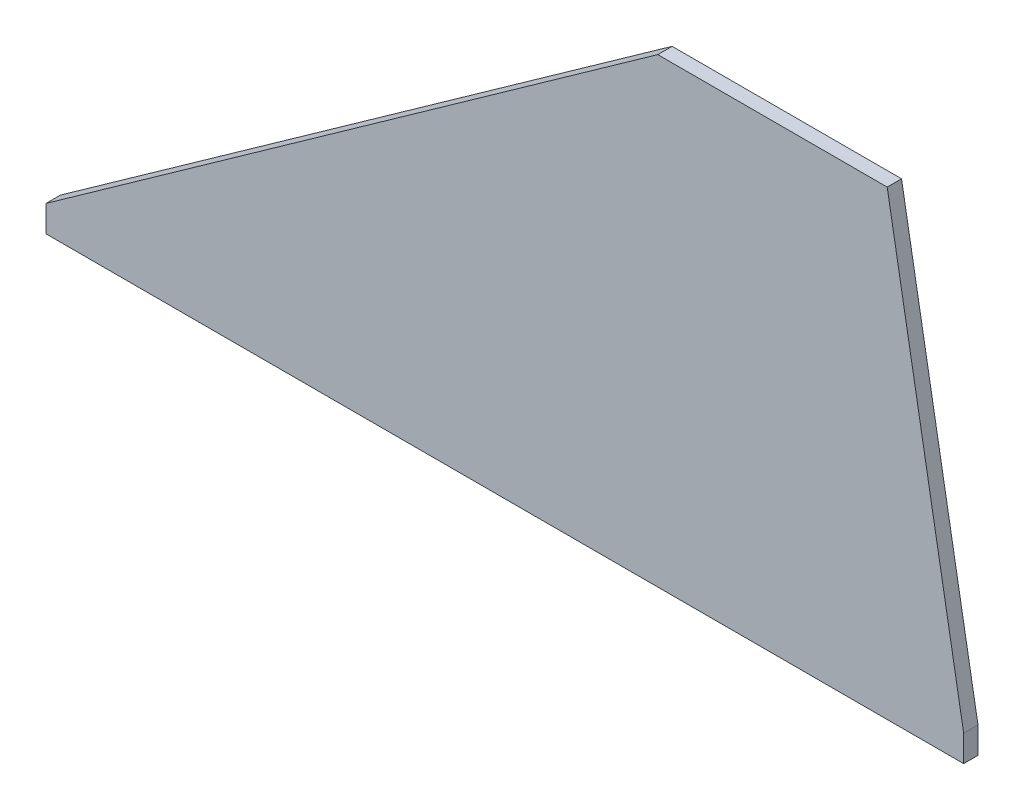
ISO-10303-21;
HEADER;
FILE_DESCRIPTION(('STEP AP214'),'2;1');
FILE_NAME('part.step','',(''),(''),'','','');
FILE_SCHEMA(('AUTOMOTIVE_DESIGN { 1 0 10303 214 1 1 1 1 }'));
ENDSEC;
DATA;
#1=APPLICATION_CONTEXT('core data for automotive mechanical design processes');
#2=APPLICATION_PROTOCOL_DEFINITION('international standard','automotive_design',2000,#1);
#3=PRODUCT_CONTEXT('',#1,'mechanical');
#4=PRODUCT('Part','Part','',(#3));
#5=PRODUCT_RELATED_PRODUCT_CATEGORY('part','',(#4));
#6=PRODUCT_DEFINITION_FORMATION('','',#4);
#7=PRODUCT_DEFINITION_CONTEXT('part definition',#1,'design');
#8=PRODUCT_DEFINITION('design','',#6,#7);
#9=PRODUCT_DEFINITION_SHAPE('','',#8);
#10=(LENGTH_UNIT() NAMED_UNIT(*) SI_UNIT(.MILLI.,.METRE.));
#11=(NAMED_UNIT(*) PLANE_ANGLE_UNIT() SI_UNIT($,.RADIAN.));
#12=(NAMED_UNIT(*) SI_UNIT($,.STERADIAN.) SOLID_ANGLE_UNIT());
#13=UNCERTAINTY_MEASURE_WITH_UNIT(LENGTH_MEASURE(1.E-05),#10,'distance_accuracy_value','');
#14=(GEOMETRIC_REPRESENTATION_CONTEXT(3) GLOBAL_UNCERTAINTY_ASSIGNED_CONTEXT((#13)) GLOBAL_UNIT_ASSIGNED_CONTEXT((#10,
#11,#12)) REPRESENTATION_CONTEXT('',''));
#15=CARTESIAN_POINT('',(0.,0.,0.));
#16=DIRECTION('',(0.,0.,1.));
#17=DIRECTION('',(1.,0.,0.));
#18=AXIS2_PLACEMENT_3D('',#15,#16,#17);
#19=CARTESIAN_POINT('',(0.,8.763,2.38125));
#20=DIRECTION('',(1.,0.,0.));
#21=DIRECTION('',(0.,0.,-1.));
#22=AXIS2_PLACEMENT_3D('',#19,#20,#21);
#23=PLANE('',#22);
#24=DIRECTION('',(0.,-1.,0.));
#25=VECTOR('',#24,1.);
#26=CARTESIAN_POINT('',(0.,8.763,-2.38125));
#27=LINE('',#26,#25);
#28=CARTESIAN_POINT('',(0.,8.763,-2.38125));
#29=VERTEX_POINT('',#28);
#30=CARTESIAN_POINT('',(0.,0.,-2.38125));
#31=VERTEX_POINT('',#30);
#32=EDGE_CURVE('E117',#29,#31,#27,.T.);
#33=ORIENTED_EDGE('',*,*,#32,.T.);
#34=DIRECTION('',(0.,0.,-1.));
#35=VECTOR('',#34,1.);
#36=CARTESIAN_POINT('',(0.,0.,2.38125));
#37=LINE('',#36,#35);
#38=CARTESIAN_POINT('',(0.,0.,2.38125));
#39=VERTEX_POINT('',#38);
#40=EDGE_CURVE('E11',#39,#31,#37,.T.);
#41=ORIENTED_EDGE('',*,*,#40,.F.);
#42=DIRECTION('',(0.,-1.,0.));
#43=VECTOR('',#42,1.);
#44=CARTESIAN_POINT('',(0.,8.763,2.38125));
#45=LINE('',#44,#43);
#46=CARTESIAN_POINT('',(0.,8.763,2.38125));
#47=VERTEX_POINT('',#46);
#48=EDGE_CURVE('E127',#47,#39,#45,.T.);
#49=ORIENTED_EDGE('',*,*,#48,.F.);
#50=DIRECTION('',(0.,0.,-1.));
#51=VECTOR('',#50,1.);
#52=CARTESIAN_POINT('',(0.,8.763,2.38125));
#53=LINE('',#52,#51);
#54=EDGE_CURVE('E113',#47,#29,#53,.T.);
#55=ORIENTED_EDGE('',*,*,#54,.T.);
#56=EDGE_LOOP('',(#33,#41,#49,#55));
#57=FACE_BOUND('',#56,.T.);
#58=ADVANCED_FACE('F33',(#57),#23,.F.);
#59=CARTESIAN_POINT('',(0.,0.,2.38125));
#60=DIRECTION('',(0.,1.,0.));
#61=DIRECTION('',(0.,0.,1.));
#62=AXIS2_PLACEMENT_3D('',#59,#60,#61);
#63=PLANE('',#62);
#64=DIRECTION('',(1.,0.,0.));
#65=VECTOR('',#64,1.);
#66=CARTESIAN_POINT('',(0.,0.,-2.38125));
#67=LINE('',#66,#65);
#68=CARTESIAN_POINT('',(304.8,0.,-2.38125));
#69=VERTEX_POINT('',#68);
#70=EDGE_CURVE('E120',#31,#69,#67,.T.);
#71=ORIENTED_EDGE('',*,*,#70,.T.);
#72=DIRECTION('',(0.,0.,-1.));
#73=VECTOR('',#72,1.);
#74=CARTESIAN_POINT('',(304.8,0.,2.38125));
#75=LINE('',#74,#73);
#76=CARTESIAN_POINT('',(304.8,0.,2.38125));
#77=VERTEX_POINT('',#76);
#78=EDGE_CURVE('E41',#77,#69,#75,.T.);
#79=ORIENTED_EDGE('',*,*,#78,.F.);
#80=DIRECTION('',(1.,0.,0.));
#81=VECTOR('',#80,1.);
#82=CARTESIAN_POINT('',(0.,0.,2.38125));
#83=LINE('',#82,#81);
#84=EDGE_CURVE('E86',#39,#77,#83,.T.);
#85=ORIENTED_EDGE('',*,*,#84,.F.);
#86=ORIENTED_EDGE('',*,*,#40,.T.);
#87=EDGE_LOOP('',(#71,#79,#85,#86));
#88=FACE_BOUND('',#87,.T.);
#89=ADVANCED_FACE('F151',(#88),#63,.F.);
#90=CARTESIAN_POINT('',(304.8,0.,2.38125));
#91=DIRECTION('',(-1.,0.,0.));
#92=DIRECTION('',(0.,0.,1.));
#93=AXIS2_PLACEMENT_3D('',#90,#91,#92);
#94=PLANE('',#93);
#95=DIRECTION('',(0.,1.,0.));
#96=VECTOR('',#95,1.);
#97=CARTESIAN_POINT('',(304.8,0.,-2.38125));
#98=LINE('',#97,#96);
#99=CARTESIAN_POINT('',(304.8,8.763,-2.38125));
#100=VERTEX_POINT('',#99);
#101=EDGE_CURVE('E122',#69,#100,#98,.T.);
#102=ORIENTED_EDGE('',*,*,#101,.T.);
#103=DIRECTION('',(0.,0.,-1.));
#104=VECTOR('',#103,1.);
#105=CARTESIAN_POINT('',(304.8,8.763,2.38125));
#106=LINE('',#105,#104);
#107=CARTESIAN_POINT('',(304.8,8.763,2.38125));
#108=VERTEX_POINT('',#107);
#109=EDGE_CURVE('E108',#108,#100,#106,.T.);
#110=ORIENTED_EDGE('',*,*,#109,.F.);
#111=DIRECTION('',(0.,1.,0.));
#112=VECTOR('',#111,1.);
#113=CARTESIAN_POINT('',(304.8,0.,2.38125));
#114=LINE('',#113,#112);
#115=EDGE_CURVE('E99',#77,#108,#114,.T.);
#116=ORIENTED_EDGE('',*,*,#115,.F.);
#117=ORIENTED_EDGE('',*,*,#78,.T.);
#118=EDGE_LOOP('',(#102,#110,#116,#117));
#119=FACE_BOUND('',#118,.T.);
#120=ADVANCED_FACE('F133',(#119),#94,.F.);
#121=CARTESIAN_POINT('',(304.8,8.763,2.38125));
#122=DIRECTION('',(-0.98487933125003,-0.173241746921729,0.));
#123=DIRECTION('',(0.173241746921729,-0.984879331250031,0.));
#124=AXIS2_PLACEMENT_3D('',#121,#122,#123);
#125=PLANE('',#124);
#126=DIRECTION('',(-0.173241746921729,0.984879331250031,0.));
#127=VECTOR('',#126,1.);
#128=CARTESIAN_POINT('',(304.8,8.763,-2.38125));
#129=LINE('',#128,#127);
#130=CARTESIAN_POINT('',(279.4,153.162,-2.38125));
#131=VERTEX_POINT('',#130);
#132=EDGE_CURVE('E107',#100,#131,#129,.T.);
#133=ORIENTED_EDGE('',*,*,#132,.T.);
#134=DIRECTION('',(0.,0.,-1.));
#135=VECTOR('',#134,1.);
#136=CARTESIAN_POINT('',(279.4,153.162,2.38125));
#137=LINE('',#136,#135);
#138=CARTESIAN_POINT('',(279.4,153.162,2.38125));
#139=VERTEX_POINT('',#138);
#140=EDGE_CURVE('E104',#139,#131,#137,.T.);
#141=ORIENTED_EDGE('',*,*,#140,.F.);
#142=DIRECTION('',(-0.173241746921729,0.984879331250031,0.));
#143=VECTOR('',#142,1.);
#144=CARTESIAN_POINT('',(304.8,8.763,2.38125));
#145=LINE('',#144,#143);
#146=EDGE_CURVE('E93',#108,#139,#145,.T.);
#147=ORIENTED_EDGE('',*,*,#146,.F.);
#148=ORIENTED_EDGE('',*,*,#109,.T.);
#149=EDGE_LOOP('',(#133,#141,#147,#148));
#150=FACE_BOUND('',#149,.T.);
#151=ADVANCED_FACE('F105',(#150),#125,.F.);
#152=CARTESIAN_POINT('',(279.4,153.162,2.38125));
#153=DIRECTION('',(0.,-1.,0.));
#154=DIRECTION('',(0.,0.,-1.));
#155=AXIS2_PLACEMENT_3D('',#152,#153,#154);
#156=PLANE('',#155);
#157=DIRECTION('',(-1.,0.,0.));
#158=VECTOR('',#157,1.);
#159=CARTESIAN_POINT('',(279.4,153.162,-2.38125));
#160=LINE('',#159,#158);
#161=CARTESIAN_POINT('',(203.2,153.162,-2.38125));
#162=VERTEX_POINT('',#161);
#163=EDGE_CURVE('E72',#131,#162,#160,.T.);
#164=ORIENTED_EDGE('',*,*,#163,.T.);
#165=DIRECTION('',(0.,0.,-1.));
#166=VECTOR('',#165,1.);
#167=CARTESIAN_POINT('',(203.2,153.162,2.38125));
#168=LINE('',#167,#166);
#169=CARTESIAN_POINT('',(203.2,153.162,2.38125));
#170=VERTEX_POINT('',#169);
#171=EDGE_CURVE('E109',#170,#162,#168,.T.);
#172=ORIENTED_EDGE('',*,*,#171,.F.);
#173=DIRECTION('',(-1.,0.,0.));
#174=VECTOR('',#173,1.);
#175=CARTESIAN_POINT('',(279.4,153.162,2.38125));
#176=LINE('',#175,#174);
#177=EDGE_CURVE('E97',#139,#170,#176,.T.);
#178=ORIENTED_EDGE('',*,*,#177,.F.);
#179=ORIENTED_EDGE('',*,*,#140,.T.);
#180=EDGE_LOOP('',(#164,#172,#178,#179));
#181=FACE_BOUND('',#180,.T.);
#182=ADVANCED_FACE('F111',(#181),#156,.F.);
#183=CARTESIAN_POINT('',(203.2,153.162,2.38125));
#184=DIRECTION('',(0.57926058598099,-0.815142425303064,0.));
#185=DIRECTION('',(0.815142425303064,0.57926058598099,0.));
#186=AXIS2_PLACEMENT_3D('',#183,#184,#185);
#187=PLANE('',#186);
#188=DIRECTION('',(-0.815142425303063,-0.57926058598099,0.));
#189=VECTOR('',#188,1.);
#190=CARTESIAN_POINT('',(203.2,153.162,-2.38125));
#191=LINE('',#190,#189);
#192=EDGE_CURVE('E78',#162,#29,#191,.T.);
#193=ORIENTED_EDGE('',*,*,#192,.T.);
#194=ORIENTED_EDGE('',*,*,#54,.F.);
#195=DIRECTION('',(-0.815142425303063,-0.57926058598099,0.));
#196=VECTOR('',#195,1.);
#197=CARTESIAN_POINT('',(203.2,153.162,2.38125));
#198=LINE('',#197,#196);
#199=EDGE_CURVE('E49',#170,#47,#198,.T.);
#200=ORIENTED_EDGE('',*,*,#199,.F.);
#201=ORIENTED_EDGE('',*,*,#171,.T.);
#202=EDGE_LOOP('',(#193,#194,#200,#201));
#203=FACE_BOUND('',#202,.T.);
#204=ADVANCED_FACE('F140',(#203),#187,.F.);
#205=CARTESIAN_POINT('',(0.,0.,2.38125));
#206=DIRECTION('',(0.,0.,1.));
#207=DIRECTION('',(1.,0.,0.));
#208=AXIS2_PLACEMENT_3D('',#205,#206,#207);
#209=PLANE('',#208);
#210=ORIENTED_EDGE('',*,*,#48,.T.);
#211=ORIENTED_EDGE('',*,*,#84,.T.);
#212=ORIENTED_EDGE('',*,*,#115,.T.);
#213=ORIENTED_EDGE('',*,*,#146,.T.);
#214=ORIENTED_EDGE('',*,*,#177,.T.);
#215=ORIENTED_EDGE('',*,*,#199,.T.);
#216=EDGE_LOOP('',(#210,#211,#212,#213,#214,#215));
#217=FACE_BOUND('',#216,.T.);
#218=ADVANCED_FACE('F95',(#217),#209,.T.);
#219=CARTESIAN_POINT('',(0.,0.,-2.38125));
#220=DIRECTION('',(0.,0.,1.));
#221=DIRECTION('',(1.,0.,0.));
#222=AXIS2_PLACEMENT_3D('',#219,#220,#221);
#223=PLANE('',#222);
#224=ORIENTED_EDGE('',*,*,#32,.F.);
#225=ORIENTED_EDGE('',*,*,#192,.F.);
#226=ORIENTED_EDGE('',*,*,#163,.F.);
#227=ORIENTED_EDGE('',*,*,#132,.F.);
#228=ORIENTED_EDGE('',*,*,#101,.F.);
#229=ORIENTED_EDGE('',*,*,#70,.F.);
#230=EDGE_LOOP('',(#224,#225,#226,#227,#228,#229));
#231=FACE_BOUND('',#230,.T.);
#232=ADVANCED_FACE('F136',(#231),#223,.F.);
#233=CLOSED_SHELL('',(#58,#89,#120,#151,#182,#204,#218,#232));
#234=MANIFOLD_SOLID_BREP('B2',#233);
#235=ADVANCED_BREP_SHAPE_REPRESENTATION('',(#18,#234),#14);
#236=SHAPE_DEFINITION_REPRESENTATION(#9,#235);
ENDSEC;
END-ISO-10303-21;
